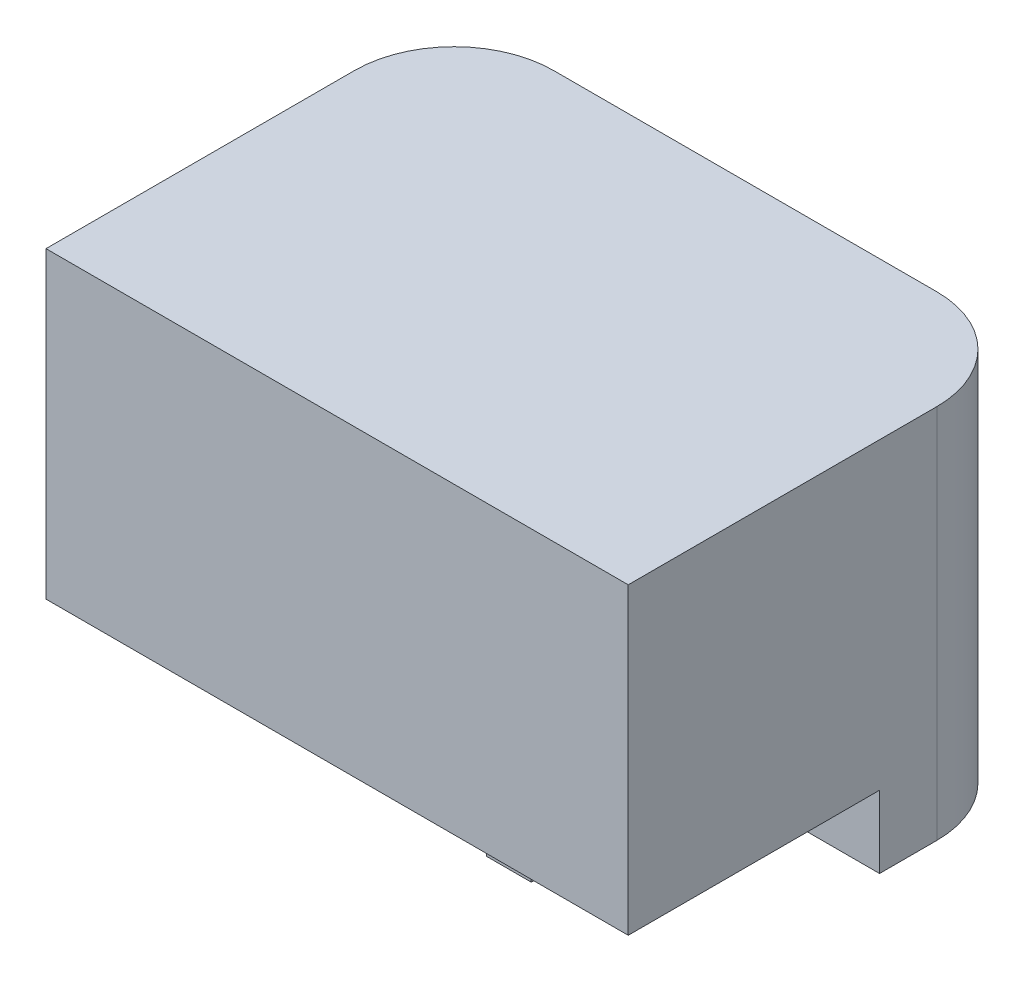
ISO-10303-21;
HEADER;
FILE_DESCRIPTION(('STEP AP214'),'2;1');
FILE_NAME('part.step','',(''),(''),'','','');
FILE_SCHEMA(('AUTOMOTIVE_DESIGN { 1 0 10303 214 1 1 1 1 }'));
ENDSEC;
DATA;
#1=APPLICATION_CONTEXT('core data for automotive mechanical design processes');
#2=APPLICATION_PROTOCOL_DEFINITION('international standard','automotive_design',2000,#1);
#3=PRODUCT_CONTEXT('',#1,'mechanical');
#4=PRODUCT('Part','Part','',(#3));
#5=PRODUCT_RELATED_PRODUCT_CATEGORY('part','',(#4));
#6=PRODUCT_DEFINITION_FORMATION('','',#4);
#7=PRODUCT_DEFINITION_CONTEXT('part definition',#1,'design');
#8=PRODUCT_DEFINITION('design','',#6,#7);
#9=PRODUCT_DEFINITION_SHAPE('','',#8);
#10=(LENGTH_UNIT() NAMED_UNIT(*) SI_UNIT(.MILLI.,.METRE.));
#11=(NAMED_UNIT(*) PLANE_ANGLE_UNIT() SI_UNIT($,.RADIAN.));
#12=(NAMED_UNIT(*) SI_UNIT($,.STERADIAN.) SOLID_ANGLE_UNIT());
#13=UNCERTAINTY_MEASURE_WITH_UNIT(LENGTH_MEASURE(1.E-05),#10,'distance_accuracy_value','');
#14=(GEOMETRIC_REPRESENTATION_CONTEXT(3) GLOBAL_UNCERTAINTY_ASSIGNED_CONTEXT((#13)) GLOBAL_UNIT_ASSIGNED_CONTEXT((#10,
#11,#12)) REPRESENTATION_CONTEXT('',''));
#15=CARTESIAN_POINT('',(0.,0.,0.));
#16=DIRECTION('',(0.,0.,1.));
#17=DIRECTION('',(1.,0.,0.));
#18=AXIS2_PLACEMENT_3D('',#15,#16,#17);
#19=CARTESIAN_POINT('',(117.,29.,115.536158907566));
#20=DIRECTION('',(0.,1.,0.));
#21=DIRECTION('',(0.,0.,1.));
#22=AXIS2_PLACEMENT_3D('',#19,#20,#21);
#23=PLANE('',#22);
#24=DIRECTION('',(0.,0.,-1.));
#25=VECTOR('',#24,1.);
#26=CARTESIAN_POINT('',(-117.,29.,115.536158907566));
#27=LINE('',#26,#25);
#28=CARTESIAN_POINT('',(-117.,29.,82.));
#29=VERTEX_POINT('',#28);
#30=CARTESIAN_POINT('',(-117.,29.,-19.));
#31=VERTEX_POINT('',#30);
#32=EDGE_CURVE('E143',#29,#31,#27,.T.);
#33=ORIENTED_EDGE('',*,*,#32,.T.);
#34=DIRECTION('',(-1.,0.,0.));
#35=VECTOR('',#34,1.);
#36=CARTESIAN_POINT('',(117.,29.,-19.));
#37=LINE('',#36,#35);
#38=CARTESIAN_POINT('',(117.,29.,-19.));
#39=VERTEX_POINT('',#38);
#40=EDGE_CURVE('E156',#39,#31,#37,.T.);
#41=ORIENTED_EDGE('',*,*,#40,.F.);
#42=DIRECTION('',(0.,0.,-1.));
#43=VECTOR('',#42,1.);
#44=CARTESIAN_POINT('',(117.,29.,115.536158907566));
#45=LINE('',#44,#43);
#46=CARTESIAN_POINT('',(117.,29.,82.));
#47=VERTEX_POINT('',#46);
#48=EDGE_CURVE('E151',#47,#39,#45,.T.);
#49=ORIENTED_EDGE('',*,*,#48,.F.);
#50=DIRECTION('',(1.,0.,0.));
#51=VECTOR('',#50,1.);
#52=CARTESIAN_POINT('',(-117.,29.,82.));
#53=LINE('',#52,#51);
#54=EDGE_CURVE('E189',#29,#47,#53,.T.);
#55=ORIENTED_EDGE('',*,*,#54,.F.);
#56=EDGE_LOOP('',(#33,#41,#49,#55));
#57=FACE_BOUND('',#56,.T.);
#58=DIRECTION('',(0.,0.,1.));
#59=VECTOR('',#58,1.);
#60=CARTESIAN_POINT('',(9.00000000000001,29.,13.));
#61=LINE('',#60,#59);
#62=CARTESIAN_POINT('',(9.00000000000002,29.,-17.));
#63=VERTEX_POINT('',#62);
#64=CARTESIAN_POINT('',(9.00000000000001,29.,13.));
#65=VERTEX_POINT('',#64);
#66=EDGE_CURVE('E142',#63,#65,#61,.T.);
#67=ORIENTED_EDGE('',*,*,#66,.F.);
#68=DIRECTION('',(1.,0.,0.));
#69=VECTOR('',#68,1.);
#70=CARTESIAN_POINT('',(-8.99999999999999,29.,-17.));
#71=LINE('',#70,#69);
#72=CARTESIAN_POINT('',(-8.99999999999999,29.,-17.));
#73=VERTEX_POINT('',#72);
#74=EDGE_CURVE('E139',#73,#63,#71,.T.);
#75=ORIENTED_EDGE('',*,*,#74,.F.);
#76=DIRECTION('',(0.,0.,-1.));
#77=VECTOR('',#76,1.);
#78=CARTESIAN_POINT('',(-8.99999999999999,29.,13.));
#79=LINE('',#78,#77);
#80=CARTESIAN_POINT('',(-8.99999999999998,29.,13.));
#81=VERTEX_POINT('',#80);
#82=EDGE_CURVE('E53',#81,#73,#79,.T.);
#83=ORIENTED_EDGE('',*,*,#82,.F.);
#84=DIRECTION('',(-1.,0.,0.));
#85=VECTOR('',#84,1.);
#86=CARTESIAN_POINT('',(-8.99999999999999,29.,13.));
#87=LINE('',#86,#85);
#88=EDGE_CURVE('E48',#65,#81,#87,.T.);
#89=ORIENTED_EDGE('',*,*,#88,.F.);
#90=EDGE_LOOP('',(#67,#75,#83,#89));
#91=FACE_BOUND('',#90,.T.);
#92=ADVANCED_FACE('F33',(#57,#91),#23,.F.);
#93=CARTESIAN_POINT('',(117.,151.,-82.));
#94=DIRECTION('',(-1.,0.,0.));
#95=DIRECTION('',(0.,0.,1.));
#96=AXIS2_PLACEMENT_3D('',#93,#94,#95);
#97=PLANE('',#96);
#98=DIRECTION('',(0.,0.,-1.));
#99=VECTOR('',#98,1.);
#100=CARTESIAN_POINT('',(117.,0.,-82.));
#101=LINE('',#100,#99);
#102=CARTESIAN_POINT('',(117.,0.,-19.));
#103=VERTEX_POINT('',#102);
#104=CARTESIAN_POINT('',(117.,0.,-42.));
#105=VERTEX_POINT('',#104);
#106=EDGE_CURVE('E162',#103,#105,#101,.T.);
#107=ORIENTED_EDGE('',*,*,#106,.T.);
#108=DIRECTION('',(0.,-1.,0.));
#109=VECTOR('',#108,1.);
#110=CARTESIAN_POINT('',(117.,151.,-42.));
#111=LINE('',#110,#109);
#112=CARTESIAN_POINT('',(117.,151.,-42.));
#113=VERTEX_POINT('',#112);
#114=EDGE_CURVE('E201',#105,#113,#111,.F.);
#115=ORIENTED_EDGE('',*,*,#114,.T.);
#116=DIRECTION('',(0.,0.,-1.));
#117=VECTOR('',#116,1.);
#118=CARTESIAN_POINT('',(117.,151.,-82.));
#119=LINE('',#118,#117);
#120=CARTESIAN_POINT('',(117.,151.,82.));
#121=VERTEX_POINT('',#120);
#122=EDGE_CURVE('E163',#121,#113,#119,.T.);
#123=ORIENTED_EDGE('',*,*,#122,.F.);
#124=DIRECTION('',(0.,-1.,0.));
#125=VECTOR('',#124,1.);
#126=CARTESIAN_POINT('',(117.,151.,82.));
#127=LINE('',#126,#125);
#128=EDGE_CURVE('E174',#121,#47,#127,.T.);
#129=ORIENTED_EDGE('',*,*,#128,.T.);
#130=ORIENTED_EDGE('',*,*,#48,.T.);
#131=DIRECTION('',(0.,-1.,0.));
#132=VECTOR('',#131,1.);
#133=CARTESIAN_POINT('',(117.,-17.0323581426454,-19.));
#134=LINE('',#133,#132);
#135=EDGE_CURVE('E154',#39,#103,#134,.T.);
#136=ORIENTED_EDGE('',*,*,#135,.T.);
#137=EDGE_LOOP('',(#107,#115,#123,#129,#130,#136));
#138=FACE_BOUND('',#137,.T.);
#139=ADVANCED_FACE('F222',(#138),#97,.F.);
#140=CARTESIAN_POINT('',(-117.,151.,-82.));
#141=DIRECTION('',(0.,0.,1.));
#142=DIRECTION('',(1.,0.,0.));
#143=AXIS2_PLACEMENT_3D('',#140,#141,#142);
#144=PLANE('',#143);
#145=DIRECTION('',(-1.,0.,0.));
#146=VECTOR('',#145,1.);
#147=CARTESIAN_POINT('',(-117.,151.,-82.));
#148=LINE('',#147,#146);
#149=CARTESIAN_POINT('',(77.,151.,-82.));
#150=VERTEX_POINT('',#149);
#151=CARTESIAN_POINT('',(-77.,151.,-82.));
#152=VERTEX_POINT('',#151);
#153=EDGE_CURVE('E166',#150,#152,#148,.T.);
#154=ORIENTED_EDGE('',*,*,#153,.F.);
#155=DIRECTION('',(0.,-1.,0.));
#156=VECTOR('',#155,1.);
#157=CARTESIAN_POINT('',(77.,151.,-82.));
#158=LINE('',#157,#156);
#159=CARTESIAN_POINT('',(77.,0.,-82.));
#160=VERTEX_POINT('',#159);
#161=EDGE_CURVE('E194',#150,#160,#158,.T.);
#162=ORIENTED_EDGE('',*,*,#161,.T.);
#163=DIRECTION('',(-1.,0.,0.));
#164=VECTOR('',#163,1.);
#165=CARTESIAN_POINT('',(-117.,0.,-82.));
#166=LINE('',#165,#164);
#167=CARTESIAN_POINT('',(-77.,0.,-82.));
#168=VERTEX_POINT('',#167);
#169=EDGE_CURVE('E177',#160,#168,#166,.T.);
#170=ORIENTED_EDGE('',*,*,#169,.T.);
#171=DIRECTION('',(0.,-1.,0.));
#172=VECTOR('',#171,1.);
#173=CARTESIAN_POINT('',(-77.,151.,-82.));
#174=LINE('',#173,#172);
#175=EDGE_CURVE('E192',#168,#152,#174,.F.);
#176=ORIENTED_EDGE('',*,*,#175,.T.);
#177=EDGE_LOOP('',(#154,#162,#170,#176));
#178=FACE_BOUND('',#177,.T.);
#179=ADVANCED_FACE('F214',(#178),#144,.F.);
#180=CARTESIAN_POINT('',(-117.,151.,-82.));
#181=DIRECTION('',(1.,0.,0.));
#182=DIRECTION('',(0.,0.,-1.));
#183=AXIS2_PLACEMENT_3D('',#180,#181,#182);
#184=PLANE('',#183);
#185=DIRECTION('',(0.,0.,1.));
#186=VECTOR('',#185,1.);
#187=CARTESIAN_POINT('',(-117.,151.,-82.));
#188=LINE('',#187,#186);
#189=CARTESIAN_POINT('',(-117.,151.,-42.));
#190=VERTEX_POINT('',#189);
#191=CARTESIAN_POINT('',(-117.,151.,82.));
#192=VERTEX_POINT('',#191);
#193=EDGE_CURVE('E170',#190,#192,#188,.T.);
#194=ORIENTED_EDGE('',*,*,#193,.F.);
#195=DIRECTION('',(0.,-1.,0.));
#196=VECTOR('',#195,1.);
#197=CARTESIAN_POINT('',(-117.,151.,-42.));
#198=LINE('',#197,#196);
#199=CARTESIAN_POINT('',(-117.,0.,-42.));
#200=VERTEX_POINT('',#199);
#201=EDGE_CURVE('E11',#190,#200,#198,.T.);
#202=ORIENTED_EDGE('',*,*,#201,.T.);
#203=DIRECTION('',(0.,0.,1.));
#204=VECTOR('',#203,1.);
#205=CARTESIAN_POINT('',(-117.,0.,-82.));
#206=LINE('',#205,#204);
#207=CARTESIAN_POINT('',(-117.,0.,-19.));
#208=VERTEX_POINT('',#207);
#209=EDGE_CURVE('E167',#200,#208,#206,.T.);
#210=ORIENTED_EDGE('',*,*,#209,.T.);
#211=DIRECTION('',(0.,-1.,0.));
#212=VECTOR('',#211,1.);
#213=CARTESIAN_POINT('',(-117.,-17.0323581426454,-19.));
#214=LINE('',#213,#212);
#215=EDGE_CURVE('E145',#31,#208,#214,.T.);
#216=ORIENTED_EDGE('',*,*,#215,.F.);
#217=ORIENTED_EDGE('',*,*,#32,.F.);
#218=DIRECTION('',(0.,-1.,0.));
#219=VECTOR('',#218,1.);
#220=CARTESIAN_POINT('',(-117.,151.,82.));
#221=LINE('',#220,#219);
#222=EDGE_CURVE('E183',#192,#29,#221,.T.);
#223=ORIENTED_EDGE('',*,*,#222,.F.);
#224=EDGE_LOOP('',(#194,#202,#210,#216,#217,#223));
#225=FACE_BOUND('',#224,.T.);
#226=ADVANCED_FACE('F230',(#225),#184,.F.);
#227=CARTESIAN_POINT('',(-117.,151.,82.));
#228=DIRECTION('',(0.,0.,-1.));
#229=DIRECTION('',(-1.,0.,0.));
#230=AXIS2_PLACEMENT_3D('',#227,#228,#229);
#231=PLANE('',#230);
#232=ORIENTED_EDGE('',*,*,#222,.T.);
#233=ORIENTED_EDGE('',*,*,#54,.T.);
#234=ORIENTED_EDGE('',*,*,#128,.F.);
#235=DIRECTION('',(1.,0.,0.));
#236=VECTOR('',#235,1.);
#237=CARTESIAN_POINT('',(-117.,151.,82.));
#238=LINE('',#237,#236);
#239=EDGE_CURVE('E172',#192,#121,#238,.T.);
#240=ORIENTED_EDGE('',*,*,#239,.F.);
#241=EDGE_LOOP('',(#232,#233,#234,#240));
#242=FACE_BOUND('',#241,.T.);
#243=ADVANCED_FACE('F238',(#242),#231,.F.);
#244=CARTESIAN_POINT('',(0.,151.,0.));
#245=DIRECTION('',(0.,1.,0.));
#246=DIRECTION('',(0.,0.,1.));
#247=AXIS2_PLACEMENT_3D('',#244,#245,#246);
#248=PLANE('',#247);
#249=ORIENTED_EDGE('',*,*,#122,.T.);
#250=CARTESIAN_POINT('',(77.,151.,-42.));
#251=DIRECTION('',(0.,1.,0.));
#252=DIRECTION('',(0.,0.,1.));
#253=AXIS2_PLACEMENT_3D('',#250,#251,#252);
#254=CIRCLE('',#253,40.);
#255=EDGE_CURVE('E41',#113,#150,#254,.T.);
#256=ORIENTED_EDGE('',*,*,#255,.T.);
#257=ORIENTED_EDGE('',*,*,#153,.T.);
#258=CARTESIAN_POINT('',(-77.,151.,-42.));
#259=DIRECTION('',(0.,1.,0.));
#260=DIRECTION('',(0.,0.,1.));
#261=AXIS2_PLACEMENT_3D('',#258,#259,#260);
#262=CIRCLE('',#261,40.);
#263=EDGE_CURVE('E203',#152,#190,#262,.T.);
#264=ORIENTED_EDGE('',*,*,#263,.T.);
#265=ORIENTED_EDGE('',*,*,#193,.T.);
#266=ORIENTED_EDGE('',*,*,#239,.T.);
#267=EDGE_LOOP('',(#249,#256,#257,#264,#265,#266));
#268=FACE_BOUND('',#267,.T.);
#269=ADVANCED_FACE('F207',(#268),#248,.T.);
#270=CARTESIAN_POINT('',(0.,0.,0.));
#271=DIRECTION('',(0.,1.,0.));
#272=DIRECTION('',(0.,0.,1.));
#273=AXIS2_PLACEMENT_3D('',#270,#271,#272);
#274=PLANE('',#273);
#275=ORIENTED_EDGE('',*,*,#169,.F.);
#276=CARTESIAN_POINT('',(77.,0.,-42.));
#277=DIRECTION('',(0.,1.,0.));
#278=DIRECTION('',(0.,0.,1.));
#279=AXIS2_PLACEMENT_3D('',#276,#277,#278);
#280=CIRCLE('',#279,40.);
#281=EDGE_CURVE('E199',#160,#105,#280,.F.);
#282=ORIENTED_EDGE('',*,*,#281,.T.);
#283=ORIENTED_EDGE('',*,*,#106,.F.);
#284=DIRECTION('',(-1.,0.,0.));
#285=VECTOR('',#284,1.);
#286=CARTESIAN_POINT('',(0.,0.,-19.));
#287=LINE('',#286,#285);
#288=EDGE_CURVE('E186',#103,#208,#287,.T.);
#289=ORIENTED_EDGE('',*,*,#288,.T.);
#290=ORIENTED_EDGE('',*,*,#209,.F.);
#291=CARTESIAN_POINT('',(-77.,0.,-42.));
#292=DIRECTION('',(0.,1.,0.));
#293=DIRECTION('',(0.,0.,1.));
#294=AXIS2_PLACEMENT_3D('',#291,#292,#293);
#295=CIRCLE('',#294,40.);
#296=EDGE_CURVE('E197',#200,#168,#295,.F.);
#297=ORIENTED_EDGE('',*,*,#296,.T.);
#298=EDGE_LOOP('',(#275,#282,#283,#289,#290,#297));
#299=FACE_BOUND('',#298,.T.);
#300=ADVANCED_FACE('F220',(#299),#274,.F.);
#301=CARTESIAN_POINT('',(117.,-17.0323581426454,-19.));
#302=DIRECTION('',(0.,0.,-1.));
#303=DIRECTION('',(0.,1.,0.));
#304=AXIS2_PLACEMENT_3D('',#301,#302,#303);
#305=PLANE('',#304);
#306=ORIENTED_EDGE('',*,*,#135,.F.);
#307=ORIENTED_EDGE('',*,*,#40,.T.);
#308=ORIENTED_EDGE('',*,*,#215,.T.);
#309=ORIENTED_EDGE('',*,*,#288,.F.);
#310=EDGE_LOOP('',(#306,#307,#308,#309));
#311=FACE_BOUND('',#310,.T.);
#312=ADVANCED_FACE('F225',(#311),#305,.F.);
#313=CARTESIAN_POINT('',(77.,151.,-42.));
#314=DIRECTION('',(0.,-1.,0.));
#315=DIRECTION('',(0.,0.,-1.));
#316=AXIS2_PLACEMENT_3D('',#313,#314,#315);
#317=CYLINDRICAL_SURFACE('',#316,40.);
#318=ORIENTED_EDGE('',*,*,#255,.F.);
#319=ORIENTED_EDGE('',*,*,#114,.F.);
#320=ORIENTED_EDGE('',*,*,#281,.F.);
#321=ORIENTED_EDGE('',*,*,#161,.F.);
#322=EDGE_LOOP('',(#318,#319,#320,#321));
#323=FACE_BOUND('',#322,.T.);
#324=ADVANCED_FACE('F217',(#323),#317,.T.);
#325=CARTESIAN_POINT('',(-77.,151.,-42.));
#326=DIRECTION('',(0.,-1.,0.));
#327=DIRECTION('',(0.,0.,-1.));
#328=AXIS2_PLACEMENT_3D('',#325,#326,#327);
#329=CYLINDRICAL_SURFACE('',#328,40.);
#330=ORIENTED_EDGE('',*,*,#263,.F.);
#331=ORIENTED_EDGE('',*,*,#175,.F.);
#332=ORIENTED_EDGE('',*,*,#296,.F.);
#333=ORIENTED_EDGE('',*,*,#201,.F.);
#334=EDGE_LOOP('',(#330,#331,#332,#333));
#335=FACE_BOUND('',#334,.T.);
#336=ADVANCED_FACE('F35',(#335),#329,.T.);
#337=CARTESIAN_POINT('',(9.00000000000001,-41.,13.));
#338=DIRECTION('',(-1.,0.,0.));
#339=DIRECTION('',(0.,0.,1.));
#340=AXIS2_PLACEMENT_3D('',#337,#338,#339);
#341=PLANE('',#340);
#342=CARTESIAN_POINT('',(9.00000000000001,-31.,0.));
#343=DIRECTION('',(-1.,0.,0.));
#344=DIRECTION('',(0.,0.,1.));
#345=AXIS2_PLACEMENT_3D('',#342,#343,#344);
#346=CIRCLE('',#345,3.);
#347=CARTESIAN_POINT('',(9.00000000000001,-31.,3.00000000000001));
#348=VERTEX_POINT('',#347);
#349=EDGE_CURVE('E243',#348,#348,#346,.T.);
#350=ORIENTED_EDGE('',*,*,#349,.T.);
#351=EDGE_LOOP('',(#350));
#352=FACE_BOUND('',#351,.T.);
#353=ORIENTED_EDGE('',*,*,#66,.T.);
#354=DIRECTION('',(0.,1.,0.));
#355=VECTOR('',#354,1.);
#356=CARTESIAN_POINT('',(9.00000000000001,-41.,13.));
#357=LINE('',#356,#355);
#358=CARTESIAN_POINT('',(9.00000000000001,-41.,13.));
#359=VERTEX_POINT('',#358);
#360=EDGE_CURVE('E123',#359,#65,#357,.T.);
#361=ORIENTED_EDGE('',*,*,#360,.F.);
#362=DIRECTION('',(0.,0.,1.));
#363=VECTOR('',#362,1.);
#364=CARTESIAN_POINT('',(9.00000000000001,-41.,13.));
#365=LINE('',#364,#363);
#366=CARTESIAN_POINT('',(9.00000000000002,-41.,-17.));
#367=VERTEX_POINT('',#366);
#368=EDGE_CURVE('E130',#367,#359,#365,.T.);
#369=ORIENTED_EDGE('',*,*,#368,.F.);
#370=DIRECTION('',(0.,1.,0.));
#371=VECTOR('',#370,1.);
#372=CARTESIAN_POINT('',(9.00000000000002,-41.,-17.));
#373=LINE('',#372,#371);
#374=EDGE_CURVE('E248',#367,#63,#373,.T.);
#375=ORIENTED_EDGE('',*,*,#374,.T.);
#376=EDGE_LOOP('',(#353,#361,#369,#375));
#377=FACE_BOUND('',#376,.T.);
#378=ADVANCED_FACE('F141',(#352,#377),#341,.F.);
#379=CARTESIAN_POINT('',(-8.99999999999999,-41.,13.));
#380=DIRECTION('',(0.,0.,-1.));
#381=DIRECTION('',(0.,1.,0.));
#382=AXIS2_PLACEMENT_3D('',#379,#380,#381);
#383=PLANE('',#382);
#384=ORIENTED_EDGE('',*,*,#88,.T.);
#385=DIRECTION('',(0.,1.,0.));
#386=VECTOR('',#385,1.);
#387=CARTESIAN_POINT('',(-8.99999999999999,-41.,13.));
#388=LINE('',#387,#386);
#389=CARTESIAN_POINT('',(-8.99999999999999,-41.,13.));
#390=VERTEX_POINT('',#389);
#391=EDGE_CURVE('E126',#390,#81,#388,.T.);
#392=ORIENTED_EDGE('',*,*,#391,.F.);
#393=DIRECTION('',(-1.,0.,0.));
#394=VECTOR('',#393,1.);
#395=CARTESIAN_POINT('',(-8.99999999999999,-41.,13.));
#396=LINE('',#395,#394);
#397=EDGE_CURVE('E119',#359,#390,#396,.T.);
#398=ORIENTED_EDGE('',*,*,#397,.F.);
#399=ORIENTED_EDGE('',*,*,#360,.T.);
#400=EDGE_LOOP('',(#384,#392,#398,#399));
#401=FACE_BOUND('',#400,.T.);
#402=ADVANCED_FACE('F121',(#401),#383,.F.);
#403=CARTESIAN_POINT('',(-8.99999999999999,-41.,13.));
#404=DIRECTION('',(1.,0.,0.));
#405=DIRECTION('',(0.,0.,-1.));
#406=AXIS2_PLACEMENT_3D('',#403,#404,#405);
#407=PLANE('',#406);
#408=CARTESIAN_POINT('',(-8.99999999999999,-31.,0.));
#409=DIRECTION('',(-1.,0.,0.));
#410=DIRECTION('',(0.,0.,1.));
#411=AXIS2_PLACEMENT_3D('',#408,#409,#410);
#412=CIRCLE('',#411,3.);
#413=CARTESIAN_POINT('',(-8.99999999999999,-31.,3.));
#414=VERTEX_POINT('',#413);
#415=EDGE_CURVE('E259',#414,#414,#412,.T.);
#416=ORIENTED_EDGE('',*,*,#415,.F.);
#417=EDGE_LOOP('',(#416));
#418=FACE_BOUND('',#417,.T.);
#419=ORIENTED_EDGE('',*,*,#82,.T.);
#420=DIRECTION('',(0.,1.,0.));
#421=VECTOR('',#420,1.);
#422=CARTESIAN_POINT('',(-8.99999999999999,-41.,-17.));
#423=LINE('',#422,#421);
#424=CARTESIAN_POINT('',(-8.99999999999999,-41.,-17.));
#425=VERTEX_POINT('',#424);
#426=EDGE_CURVE('E147',#425,#73,#423,.T.);
#427=ORIENTED_EDGE('',*,*,#426,.F.);
#428=DIRECTION('',(0.,0.,-1.));
#429=VECTOR('',#428,1.);
#430=CARTESIAN_POINT('',(-8.99999999999999,-41.,13.));
#431=LINE('',#430,#429);
#432=EDGE_CURVE('E129',#390,#425,#431,.T.);
#433=ORIENTED_EDGE('',*,*,#432,.F.);
#434=ORIENTED_EDGE('',*,*,#391,.T.);
#435=EDGE_LOOP('',(#419,#427,#433,#434));
#436=FACE_BOUND('',#435,.T.);
#437=ADVANCED_FACE('F266',(#418,#436),#407,.F.);
#438=CARTESIAN_POINT('',(-8.99999999999999,-41.,-17.));
#439=DIRECTION('',(0.,0.,1.));
#440=DIRECTION('',(0.,-1.,0.));
#441=AXIS2_PLACEMENT_3D('',#438,#439,#440);
#442=PLANE('',#441);
#443=ORIENTED_EDGE('',*,*,#74,.T.);
#444=ORIENTED_EDGE('',*,*,#374,.F.);
#445=DIRECTION('',(1.,0.,0.));
#446=VECTOR('',#445,1.);
#447=CARTESIAN_POINT('',(-8.99999999999999,-41.,-17.));
#448=LINE('',#447,#446);
#449=EDGE_CURVE('E135',#425,#367,#448,.T.);
#450=ORIENTED_EDGE('',*,*,#449,.F.);
#451=ORIENTED_EDGE('',*,*,#426,.T.);
#452=EDGE_LOOP('',(#443,#444,#450,#451));
#453=FACE_BOUND('',#452,.T.);
#454=ADVANCED_FACE('F247',(#453),#442,.F.);
#455=CARTESIAN_POINT('',(0.,-41.,0.));
#456=DIRECTION('',(0.,-1.,0.));
#457=DIRECTION('',(0.,0.,-1.));
#458=AXIS2_PLACEMENT_3D('',#455,#456,#457);
#459=PLANE('',#458);
#460=ORIENTED_EDGE('',*,*,#368,.T.);
#461=ORIENTED_EDGE('',*,*,#397,.T.);
#462=ORIENTED_EDGE('',*,*,#432,.T.);
#463=ORIENTED_EDGE('',*,*,#449,.T.);
#464=EDGE_LOOP('',(#460,#461,#462,#463));
#465=FACE_BOUND('',#464,.T.);
#466=ADVANCED_FACE('F133',(#465),#459,.T.);
#467=CARTESIAN_POINT('',(117.,-31.,0.));
#468=DIRECTION('',(-1.,0.,0.));
#469=DIRECTION('',(0.,0.,1.));
#470=AXIS2_PLACEMENT_3D('',#467,#468,#469);
#471=CYLINDRICAL_SURFACE('',#470,3.);
#472=ORIENTED_EDGE('',*,*,#415,.T.);
#473=EDGE_LOOP('',(#472));
#474=FACE_BOUND('',#473,.T.);
#475=ORIENTED_EDGE('',*,*,#349,.F.);
#476=EDGE_LOOP('',(#475));
#477=FACE_BOUND('',#476,.T.);
#478=ADVANCED_FACE('F263',(#474,#477),#471,.F.);
#479=CLOSED_SHELL('',(#92,#139,#179,#226,#243,#269,#300,#312,#324,#336,#378,#402,#437,#454,#466,#478));
#480=MANIFOLD_SOLID_BREP('B2',#479);
#481=ADVANCED_BREP_SHAPE_REPRESENTATION('',(#18,#480),#14);
#482=SHAPE_DEFINITION_REPRESENTATION(#9,#481);
ENDSEC;
END-ISO-10303-21;
